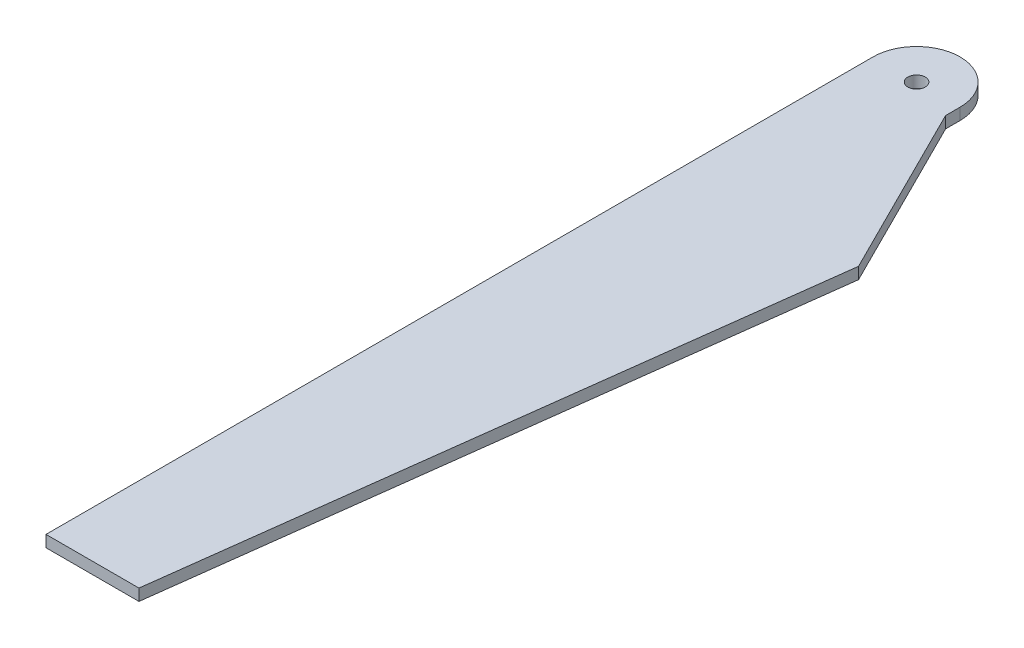
ISO-10303-21;
HEADER;
FILE_DESCRIPTION(('STEP AP214'),'2;1');
FILE_NAME('part.step','',(''),(''),'','','');
FILE_SCHEMA(('AUTOMOTIVE_DESIGN { 1 0 10303 214 1 1 1 1 }'));
ENDSEC;
DATA;
#1=APPLICATION_CONTEXT('core data for automotive mechanical design processes');
#2=APPLICATION_PROTOCOL_DEFINITION('international standard','automotive_design',2000,#1);
#3=PRODUCT_CONTEXT('',#1,'mechanical');
#4=PRODUCT('Part','Part','',(#3));
#5=PRODUCT_RELATED_PRODUCT_CATEGORY('part','',(#4));
#6=PRODUCT_DEFINITION_FORMATION('','',#4);
#7=PRODUCT_DEFINITION_CONTEXT('part definition',#1,'design');
#8=PRODUCT_DEFINITION('design','',#6,#7);
#9=PRODUCT_DEFINITION_SHAPE('','',#8);
#10=(LENGTH_UNIT() NAMED_UNIT(*) SI_UNIT(.MILLI.,.METRE.));
#11=(NAMED_UNIT(*) PLANE_ANGLE_UNIT() SI_UNIT($,.RADIAN.));
#12=(NAMED_UNIT(*) SI_UNIT($,.STERADIAN.) SOLID_ANGLE_UNIT());
#13=UNCERTAINTY_MEASURE_WITH_UNIT(LENGTH_MEASURE(1.E-05),#10,'distance_accuracy_value','');
#14=(GEOMETRIC_REPRESENTATION_CONTEXT(3) GLOBAL_UNCERTAINTY_ASSIGNED_CONTEXT((#13)) GLOBAL_UNIT_ASSIGNED_CONTEXT((#10,
#11,#12)) REPRESENTATION_CONTEXT('',''));
#15=CARTESIAN_POINT('',(0.,0.,0.));
#16=DIRECTION('',(0.,0.,1.));
#17=DIRECTION('',(1.,0.,0.));
#18=AXIS2_PLACEMENT_3D('',#15,#16,#17);
#19=CARTESIAN_POINT('',(-15.,2.,0.));
#20=DIRECTION('',(1.,0.,0.));
#21=DIRECTION('',(0.,0.,-1.));
#22=AXIS2_PLACEMENT_3D('',#19,#20,#21);
#23=PLANE('',#22);
#24=DIRECTION('',(0.,0.,1.));
#25=VECTOR('',#24,1.);
#26=CARTESIAN_POINT('',(-15.,0.,0.));
#27=LINE('',#26,#25);
#28=CARTESIAN_POINT('',(-15.,0.,-79.0238095237859));
#29=VERTEX_POINT('',#28);
#30=CARTESIAN_POINT('',(-15.,0.,-76.5238095237859));
#31=VERTEX_POINT('',#30);
#32=EDGE_CURVE('E140',#29,#31,#27,.T.);
#33=ORIENTED_EDGE('',*,*,#32,.F.);
#34=DIRECTION('',(0.,-1.,0.));
#35=VECTOR('',#34,1.);
#36=CARTESIAN_POINT('',(-15.,2.,-79.0238095237859));
#37=LINE('',#36,#35);
#38=CARTESIAN_POINT('',(-15.,2.,-79.0238095237859));
#39=VERTEX_POINT('',#38);
#40=EDGE_CURVE('E11',#39,#29,#37,.T.);
#41=ORIENTED_EDGE('',*,*,#40,.F.);
#42=DIRECTION('',(0.,0.,1.));
#43=VECTOR('',#42,1.);
#44=CARTESIAN_POINT('',(-15.,2.,0.));
#45=LINE('',#44,#43);
#46=CARTESIAN_POINT('',(-15.,2.,-76.5238095237859));
#47=VERTEX_POINT('',#46);
#48=EDGE_CURVE('E249',#39,#47,#45,.T.);
#49=ORIENTED_EDGE('',*,*,#48,.T.);
#50=DIRECTION('',(0.,-1.,0.));
#51=VECTOR('',#50,1.);
#52=CARTESIAN_POINT('',(-15.,2.,-76.5238095237859));
#53=LINE('',#52,#51);
#54=EDGE_CURVE('E56',#47,#31,#53,.T.);
#55=ORIENTED_EDGE('',*,*,#54,.T.);
#56=EDGE_LOOP('',(#33,#41,#49,#55));
#57=FACE_BOUND('',#56,.T.);
#58=ADVANCED_FACE('F38',(#57),#23,.T.);
#59=CARTESIAN_POINT('',(-22.5,2.,-79.0238095237859));
#60=DIRECTION('',(0.,-1.,0.));
#61=DIRECTION('',(0.,0.,-1.));
#62=AXIS2_PLACEMENT_3D('',#59,#60,#61);
#63=CYLINDRICAL_SURFACE('',#62,7.5);
#64=CARTESIAN_POINT('',(-22.5,0.,-79.0238095237859));
#65=DIRECTION('',(0.,1.,0.));
#66=DIRECTION('',(0.,0.,1.));
#67=AXIS2_PLACEMENT_3D('',#64,#65,#66);
#68=CIRCLE('',#67,7.5);
#69=CARTESIAN_POINT('',(-30.,0.,-79.0238095237859));
#70=VERTEX_POINT('',#69);
#71=EDGE_CURVE('E136',#29,#70,#68,.T.);
#72=ORIENTED_EDGE('',*,*,#71,.T.);
#73=DIRECTION('',(0.,-1.,0.));
#74=VECTOR('',#73,1.);
#75=CARTESIAN_POINT('',(-30.,2.,-79.0238095237859));
#76=LINE('',#75,#74);
#77=CARTESIAN_POINT('',(-30.,2.,-79.0238095237859));
#78=VERTEX_POINT('',#77);
#79=EDGE_CURVE('E48',#78,#70,#76,.T.);
#80=ORIENTED_EDGE('',*,*,#79,.F.);
#81=CARTESIAN_POINT('',(-22.5,2.,-79.0238095237859));
#82=DIRECTION('',(0.,1.,0.));
#83=DIRECTION('',(0.,0.,1.));
#84=AXIS2_PLACEMENT_3D('',#81,#82,#83);
#85=CIRCLE('',#84,7.5);
#86=EDGE_CURVE('E252',#39,#78,#85,.T.);
#87=ORIENTED_EDGE('',*,*,#86,.F.);
#88=ORIENTED_EDGE('',*,*,#40,.T.);
#89=EDGE_LOOP('',(#72,#80,#87,#88));
#90=FACE_BOUND('',#89,.T.);
#91=ADVANCED_FACE('F137',(#90),#63,.T.);
#92=CARTESIAN_POINT('',(-30.,2.,0.));
#93=DIRECTION('',(-1.,0.,0.));
#94=DIRECTION('',(0.,0.,1.));
#95=AXIS2_PLACEMENT_3D('',#92,#93,#94);
#96=PLANE('',#95);
#97=DIRECTION('',(0.,0.,-1.));
#98=VECTOR('',#97,1.);
#99=CARTESIAN_POINT('',(-30.,0.,0.));
#100=LINE('',#99,#98);
#101=CARTESIAN_POINT('',(-30.,0.,63.4761904762141));
#102=VERTEX_POINT('',#101);
#103=EDGE_CURVE('E133',#102,#70,#100,.T.);
#104=ORIENTED_EDGE('',*,*,#103,.F.);
#105=DIRECTION('',(0.,-1.,0.));
#106=VECTOR('',#105,1.);
#107=CARTESIAN_POINT('',(-30.,2.,63.4761904762141));
#108=LINE('',#107,#106);
#109=CARTESIAN_POINT('',(-30.,2.,63.4761904762141));
#110=VERTEX_POINT('',#109);
#111=EDGE_CURVE('E119',#110,#102,#108,.T.);
#112=ORIENTED_EDGE('',*,*,#111,.F.);
#113=DIRECTION('',(0.,0.,-1.));
#114=VECTOR('',#113,1.);
#115=CARTESIAN_POINT('',(-30.,2.,0.));
#116=LINE('',#115,#114);
#117=EDGE_CURVE('E111',#110,#78,#116,.T.);
#118=ORIENTED_EDGE('',*,*,#117,.T.);
#119=ORIENTED_EDGE('',*,*,#79,.T.);
#120=EDGE_LOOP('',(#104,#112,#118,#119));
#121=FACE_BOUND('',#120,.T.);
#122=ADVANCED_FACE('F131',(#121),#96,.T.);
#123=CARTESIAN_POINT('',(0.,2.,63.4761904762141));
#124=DIRECTION('',(0.,0.,-1.));
#125=DIRECTION('',(-1.,0.,0.));
#126=AXIS2_PLACEMENT_3D('',#123,#124,#125);
#127=PLANE('',#126);
#128=DIRECTION('',(1.,0.,0.));
#129=VECTOR('',#128,1.);
#130=CARTESIAN_POINT('',(0.,0.,63.4761904762141));
#131=LINE('',#130,#129);
#132=CARTESIAN_POINT('',(-13.9830508474576,0.,63.4761904762141));
#133=VERTEX_POINT('',#132);
#134=EDGE_CURVE('E117',#102,#133,#131,.T.);
#135=ORIENTED_EDGE('',*,*,#134,.T.);
#136=DIRECTION('',(0.,-1.,0.));
#137=VECTOR('',#136,1.);
#138=CARTESIAN_POINT('',(-13.9830508474576,2.,63.4761904762141));
#139=LINE('',#138,#137);
#140=CARTESIAN_POINT('',(-13.9830508474576,2.,63.4761904762141));
#141=VERTEX_POINT('',#140);
#142=EDGE_CURVE('E98',#141,#133,#139,.T.);
#143=ORIENTED_EDGE('',*,*,#142,.F.);
#144=DIRECTION('',(1.,0.,0.));
#145=VECTOR('',#144,1.);
#146=CARTESIAN_POINT('',(0.,2.,63.4761904762141));
#147=LINE('',#146,#145);
#148=EDGE_CURVE('E104',#110,#141,#147,.T.);
#149=ORIENTED_EDGE('',*,*,#148,.F.);
#150=ORIENTED_EDGE('',*,*,#111,.T.);
#151=EDGE_LOOP('',(#135,#143,#149,#150));
#152=FACE_BOUND('',#151,.T.);
#153=ADVANCED_FACE('F115',(#152),#127,.F.);
#154=CARTESIAN_POINT('',(-5.81999737487462,2.,-0.739830174772197));
#155=DIRECTION('',(-0.992017044258856,0.,-0.126103861558329));
#156=DIRECTION('',(-0.126103861558329,0.,0.992017044258857));
#157=AXIS2_PLACEMENT_3D('',#154,#155,#156);
#158=PLANE('',#157);
#159=DIRECTION('',(0.126103861558329,0.,-0.992017044258857));
#160=VECTOR('',#159,1.);
#161=CARTESIAN_POINT('',(-5.81999737487462,0.,-0.739830174772197));
#162=LINE('',#161,#160);
#163=CARTESIAN_POINT('',(0.,0.,-46.5238095237859));
#164=VERTEX_POINT('',#163);
#165=EDGE_CURVE('E146',#133,#164,#162,.T.);
#166=ORIENTED_EDGE('',*,*,#165,.T.);
#167=DIRECTION('',(0.,-1.,0.));
#168=VECTOR('',#167,1.);
#169=CARTESIAN_POINT('',(0.,2.,-46.5238095237859));
#170=LINE('',#169,#168);
#171=CARTESIAN_POINT('',(0.,2.,-46.5238095237859));
#172=VERTEX_POINT('',#171);
#173=EDGE_CURVE('E76',#172,#164,#170,.T.);
#174=ORIENTED_EDGE('',*,*,#173,.F.);
#175=DIRECTION('',(0.126103861558329,0.,-0.992017044258857));
#176=VECTOR('',#175,1.);
#177=CARTESIAN_POINT('',(-5.81999737487462,2.,-0.739830174772197));
#178=LINE('',#177,#176);
#179=EDGE_CURVE('E94',#141,#172,#178,.T.);
#180=ORIENTED_EDGE('',*,*,#179,.F.);
#181=ORIENTED_EDGE('',*,*,#142,.T.);
#182=EDGE_LOOP('',(#166,#174,#180,#181));
#183=FACE_BOUND('',#182,.T.);
#184=ADVANCED_FACE('F96',(#183),#158,.F.);
#185=CARTESIAN_POINT('',(-22.5,2.,-79.0238095237859));
#186=DIRECTION('',(0.,-1.,0.));
#187=DIRECTION('',(0.,0.,-1.));
#188=AXIS2_PLACEMENT_3D('',#185,#186,#187);
#189=CYLINDRICAL_SURFACE('',#188,1.5);
#190=CARTESIAN_POINT('',(-22.5,2.,-79.0238095237859));
#191=DIRECTION('',(0.,1.,0.));
#192=DIRECTION('',(0.,0.,1.));
#193=AXIS2_PLACEMENT_3D('',#190,#191,#192);
#194=CIRCLE('',#193,1.5);
#195=CARTESIAN_POINT('',(-22.5,2.,-77.5238095237859));
#196=VERTEX_POINT('',#195);
#197=EDGE_CURVE('E155',#196,#196,#194,.T.);
#198=ORIENTED_EDGE('',*,*,#197,.T.);
#199=EDGE_LOOP('',(#198));
#200=FACE_BOUND('',#199,.T.);
#201=CARTESIAN_POINT('',(-22.5,0.,-79.0238095237859));
#202=DIRECTION('',(0.,1.,0.));
#203=DIRECTION('',(0.,0.,1.));
#204=AXIS2_PLACEMENT_3D('',#201,#202,#203);
#205=CIRCLE('',#204,1.5);
#206=CARTESIAN_POINT('',(-22.5,0.,-77.5238095237859));
#207=VERTEX_POINT('',#206);
#208=EDGE_CURVE('E160',#207,#207,#205,.T.);
#209=ORIENTED_EDGE('',*,*,#208,.F.);
#210=EDGE_LOOP('',(#209));
#211=FACE_BOUND('',#210,.T.);
#212=ADVANCED_FACE('F40',(#200,#211),#189,.F.);
#213=CARTESIAN_POINT('',(18.6095238095144,2.,-9.3047619047572));
#214=DIRECTION('',(0.894427190999916,0.,-0.447213595499958));
#215=DIRECTION('',(-0.447213595499958,0.,-0.894427190999916));
#216=AXIS2_PLACEMENT_3D('',#213,#214,#215);
#217=PLANE('',#216);
#218=DIRECTION('',(0.447213595499958,0.,0.894427190999916));
#219=VECTOR('',#218,1.);
#220=CARTESIAN_POINT('',(18.6095238095144,0.,-9.3047619047572));
#221=LINE('',#220,#219);
#222=EDGE_CURVE('E152',#31,#164,#221,.T.);
#223=ORIENTED_EDGE('',*,*,#222,.F.);
#224=ORIENTED_EDGE('',*,*,#54,.F.);
#225=DIRECTION('',(0.447213595499958,0.,0.894427190999916));
#226=VECTOR('',#225,1.);
#227=CARTESIAN_POINT('',(18.6095238095144,2.,-9.3047619047572));
#228=LINE('',#227,#226);
#229=EDGE_CURVE('E103',#47,#172,#228,.T.);
#230=ORIENTED_EDGE('',*,*,#229,.T.);
#231=ORIENTED_EDGE('',*,*,#173,.T.);
#232=EDGE_LOOP('',(#223,#224,#230,#231));
#233=FACE_BOUND('',#232,.T.);
#234=ADVANCED_FACE('F164',(#233),#217,.T.);
#235=CARTESIAN_POINT('',(0.,2.,0.));
#236=DIRECTION('',(0.,1.,0.));
#237=DIRECTION('',(0.,0.,1.));
#238=AXIS2_PLACEMENT_3D('',#235,#236,#237);
#239=PLANE('',#238);
#240=ORIENTED_EDGE('',*,*,#197,.F.);
#241=EDGE_LOOP('',(#240));
#242=FACE_BOUND('',#241,.T.);
#243=ORIENTED_EDGE('',*,*,#48,.F.);
#244=ORIENTED_EDGE('',*,*,#86,.T.);
#245=ORIENTED_EDGE('',*,*,#117,.F.);
#246=ORIENTED_EDGE('',*,*,#148,.T.);
#247=ORIENTED_EDGE('',*,*,#179,.T.);
#248=ORIENTED_EDGE('',*,*,#229,.F.);
#249=EDGE_LOOP('',(#243,#244,#245,#246,#247,#248));
#250=FACE_BOUND('',#249,.T.);
#251=ADVANCED_FACE('F109',(#242,#250),#239,.T.);
#252=CARTESIAN_POINT('',(0.,0.,0.));
#253=DIRECTION('',(0.,1.,0.));
#254=DIRECTION('',(0.,0.,1.));
#255=AXIS2_PLACEMENT_3D('',#252,#253,#254);
#256=PLANE('',#255);
#257=ORIENTED_EDGE('',*,*,#208,.T.);
#258=EDGE_LOOP('',(#257));
#259=FACE_BOUND('',#258,.T.);
#260=ORIENTED_EDGE('',*,*,#32,.T.);
#261=ORIENTED_EDGE('',*,*,#222,.T.);
#262=ORIENTED_EDGE('',*,*,#165,.F.);
#263=ORIENTED_EDGE('',*,*,#134,.F.);
#264=ORIENTED_EDGE('',*,*,#103,.T.);
#265=ORIENTED_EDGE('',*,*,#71,.F.);
#266=EDGE_LOOP('',(#260,#261,#262,#263,#264,#265));
#267=FACE_BOUND('',#266,.T.);
#268=ADVANCED_FACE('F142',(#259,#267),#256,.F.);
#269=CLOSED_SHELL('',(#58,#91,#122,#153,#184,#212,#234,#251,#268));
#270=MANIFOLD_SOLID_BREP('B2',#269);
#271=ADVANCED_BREP_SHAPE_REPRESENTATION('',(#18,#270),#14);
#272=SHAPE_DEFINITION_REPRESENTATION(#9,#271);
ENDSEC;
END-ISO-10303-21;
